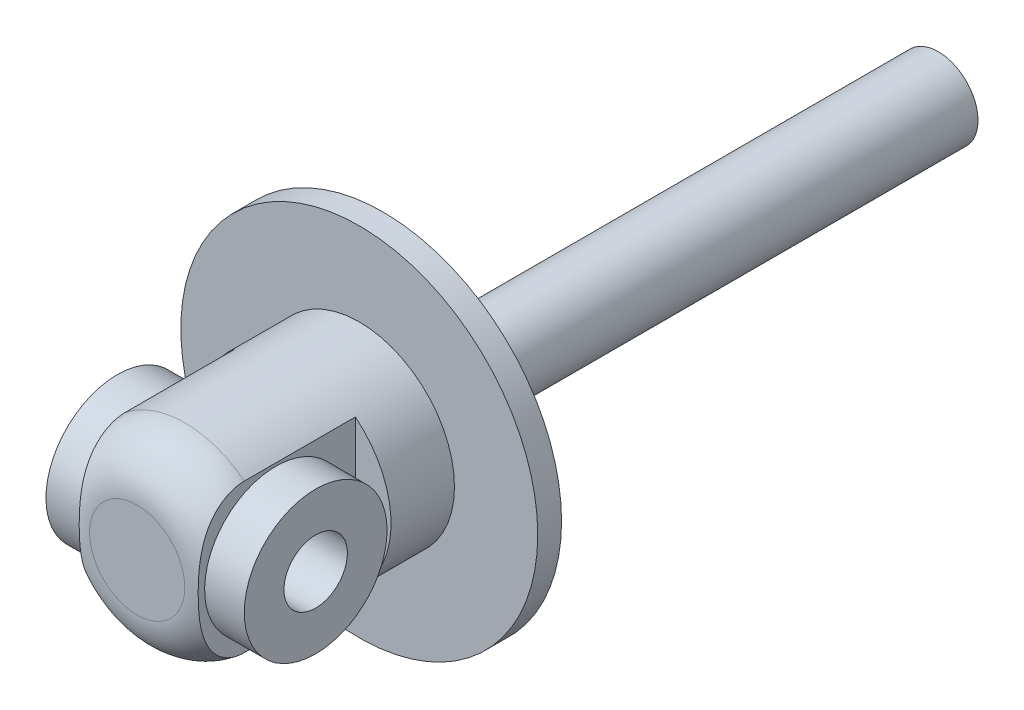
ISO-10303-21;
HEADER;
FILE_DESCRIPTION(('STEP AP214'),'2;1');
FILE_NAME('part.step','',(''),(''),'','','');
FILE_SCHEMA(('AUTOMOTIVE_DESIGN { 1 0 10303 214 1 1 1 1 }'));
ENDSEC;
DATA;
#1=APPLICATION_CONTEXT('core data for automotive mechanical design processes');
#2=APPLICATION_PROTOCOL_DEFINITION('international standard','automotive_design',2000,#1);
#3=PRODUCT_CONTEXT('',#1,'mechanical');
#4=PRODUCT('Part','Part','',(#3));
#5=PRODUCT_RELATED_PRODUCT_CATEGORY('part','',(#4));
#6=PRODUCT_DEFINITION_FORMATION('','',#4);
#7=PRODUCT_DEFINITION_CONTEXT('part definition',#1,'design');
#8=PRODUCT_DEFINITION('design','',#6,#7);
#9=PRODUCT_DEFINITION_SHAPE('','',#8);
#10=(LENGTH_UNIT() NAMED_UNIT(*) SI_UNIT(.MILLI.,.METRE.));
#11=(NAMED_UNIT(*) PLANE_ANGLE_UNIT() SI_UNIT($,.RADIAN.));
#12=(NAMED_UNIT(*) SI_UNIT($,.STERADIAN.) SOLID_ANGLE_UNIT());
#13=UNCERTAINTY_MEASURE_WITH_UNIT(LENGTH_MEASURE(1.E-05),#10,'distance_accuracy_value','');
#14=(GEOMETRIC_REPRESENTATION_CONTEXT(3) GLOBAL_UNCERTAINTY_ASSIGNED_CONTEXT((#13)) GLOBAL_UNIT_ASSIGNED_CONTEXT((#10,
#11,#12)) REPRESENTATION_CONTEXT('',''));
#15=CARTESIAN_POINT('',(0.,0.,0.));
#16=DIRECTION('',(0.,0.,1.));
#17=DIRECTION('',(1.,0.,0.));
#18=AXIS2_PLACEMENT_3D('',#15,#16,#17);
#19=CARTESIAN_POINT('',(0.,0.,101.));
#20=DIRECTION('',(0.,0.,-1.));
#21=DIRECTION('',(-1.,0.,0.));
#22=AXIS2_PLACEMENT_3D('',#19,#20,#21);
#23=CYLINDRICAL_SURFACE('',#22,12.);
#24=CARTESIAN_POINT('',(0.,0.,73.));
#25=DIRECTION('',(0.,0.,1.));
#26=DIRECTION('',(1.,0.,0.));
#27=AXIS2_PLACEMENT_3D('',#24,#25,#26);
#28=CIRCLE('',#27,12.);
#29=CARTESIAN_POINT('',(12.,0.,73.));
#30=VERTEX_POINT('',#29);
#31=EDGE_CURVE('E132',#30,#30,#28,.T.);
#32=ORIENTED_EDGE('',*,*,#31,.T.);
#33=EDGE_LOOP('',(#32));
#34=FACE_BOUND('',#33,.T.);
#35=DIRECTION('',(0.,0.,-1.));
#36=VECTOR('',#35,1.);
#37=CARTESIAN_POINT('',(-7.5,9.36749699759761,101.));
#38=LINE('',#37,#36);
#39=CARTESIAN_POINT('',(-7.5,9.3674969975976,95.));
#40=VERTEX_POINT('',#39);
#41=CARTESIAN_POINT('',(-7.5,9.36749699759761,81.));
#42=VERTEX_POINT('',#41);
#43=EDGE_CURVE('E80',#40,#42,#38,.T.);
#44=ORIENTED_EDGE('',*,*,#43,.F.);
#45=CARTESIAN_POINT('',(0.,0.,95.));
#46=DIRECTION('',(0.,0.,1.));
#47=DIRECTION('',(1.,0.,0.));
#48=AXIS2_PLACEMENT_3D('',#45,#46,#47);
#49=CIRCLE('',#48,12.);
#50=CARTESIAN_POINT('',(7.5,9.36749699759761,95.));
#51=VERTEX_POINT('',#50);
#52=EDGE_CURVE('E62',#40,#51,#49,.F.);
#53=ORIENTED_EDGE('',*,*,#52,.T.);
#54=DIRECTION('',(0.,0.,-1.));
#55=VECTOR('',#54,1.);
#56=CARTESIAN_POINT('',(7.5,9.36749699759761,101.));
#57=LINE('',#56,#55);
#58=CARTESIAN_POINT('',(7.5,9.36749699759761,81.));
#59=VERTEX_POINT('',#58);
#60=EDGE_CURVE('E143',#51,#59,#57,.T.);
#61=ORIENTED_EDGE('',*,*,#60,.T.);
#62=CARTESIAN_POINT('',(0.,0.,81.));
#63=DIRECTION('',(0.,0.,-1.));
#64=DIRECTION('',(-1.,0.,0.));
#65=AXIS2_PLACEMENT_3D('',#62,#63,#64);
#66=CIRCLE('',#65,12.);
#67=CARTESIAN_POINT('',(7.5,-9.3674969975976,81.));
#68=VERTEX_POINT('',#67);
#69=EDGE_CURVE('E96',#59,#68,#66,.T.);
#70=ORIENTED_EDGE('',*,*,#69,.T.);
#71=DIRECTION('',(0.,0.,-1.));
#72=VECTOR('',#71,1.);
#73=CARTESIAN_POINT('',(7.5,-9.3674969975976,101.));
#74=LINE('',#73,#72);
#75=CARTESIAN_POINT('',(7.5,-9.36749699759766,94.9999999999999));
#76=VERTEX_POINT('',#75);
#77=EDGE_CURVE('E149',#68,#76,#74,.F.);
#78=ORIENTED_EDGE('',*,*,#77,.T.);
#79=CARTESIAN_POINT('',(-7.5,-9.3674969975976,95.));
#80=VERTEX_POINT('',#79);
#81=EDGE_CURVE('E127',#76,#80,#49,.F.);
#82=ORIENTED_EDGE('',*,*,#81,.T.);
#83=DIRECTION('',(0.,0.,-1.));
#84=VECTOR('',#83,1.);
#85=CARTESIAN_POINT('',(-7.5,-9.3674969975976,101.));
#86=LINE('',#85,#84);
#87=CARTESIAN_POINT('',(-7.5,-9.3674969975976,81.));
#88=VERTEX_POINT('',#87);
#89=EDGE_CURVE('E54',#88,#80,#86,.F.);
#90=ORIENTED_EDGE('',*,*,#89,.F.);
#91=CARTESIAN_POINT('',(0.,0.,81.));
#92=DIRECTION('',(0.,0.,-1.));
#93=DIRECTION('',(-1.,0.,0.));
#94=AXIS2_PLACEMENT_3D('',#91,#92,#93);
#95=CIRCLE('',#94,12.);
#96=EDGE_CURVE('E90',#88,#42,#95,.T.);
#97=ORIENTED_EDGE('',*,*,#96,.T.);
#98=EDGE_LOOP('',(#44,#53,#61,#70,#78,#82,#90,#97));
#99=FACE_BOUND('',#98,.T.);
#100=ADVANCED_FACE('F38',(#34,#99),#23,.T.);
#101=CARTESIAN_POINT('',(0.,0.,95.));
#102=DIRECTION('',(0.,0.,1.));
#103=DIRECTION('',(1.,0.,0.));
#104=AXIS2_PLACEMENT_3D('',#101,#102,#103);
#105=TOROIDAL_SURFACE('',#104,6.,6.);
#106=CARTESIAN_POINT('',(0.,0.,101.));
#107=DIRECTION('',(0.,0.,1.));
#108=DIRECTION('',(1.,0.,0.));
#109=AXIS2_PLACEMENT_3D('',#106,#107,#108);
#110=CIRCLE('',#109,6.);
#111=CARTESIAN_POINT('',(6.,0.,101.));
#112=VERTEX_POINT('',#111);
#113=EDGE_CURVE('E129',#112,#112,#110,.T.);
#114=ORIENTED_EDGE('',*,*,#113,.F.);
#115=EDGE_LOOP('',(#114));
#116=FACE_BOUND('',#115,.T.);
#117=ORIENTED_EDGE('',*,*,#52,.F.);
#118=CARTESIAN_POINT('',(-7.5,0.,100.809475019311));
#119=CARTESIAN_POINT('',(-7.5,-0.18452162824242,100.809475295815));
#120=CARTESIAN_POINT('',(-7.5,-0.369043480287192,100.8077270323));
#121=CARTESIAN_POINT('',(-7.5,-0.737999394292285,100.800613062888));
#122=CARTESIAN_POINT('',(-7.5,-0.922433463434385,100.795247736707));
#123=CARTESIAN_POINT('',(-7.5,-1.29122559425462,100.780538513706));
#124=CARTESIAN_POINT('',(-7.5,-1.47558358999919,100.771192921557));
#125=CARTESIAN_POINT('',(-7.5,-1.84401846668315,100.747950764088));
#126=CARTESIAN_POINT('',(-7.5,-2.02809534398339,100.734054140347));
#127=CARTESIAN_POINT('',(-7.5,-2.39498843631837,100.701027325669));
#128=CARTESIAN_POINT('',(-7.5,-2.57780665418326,100.681920129909));
#129=CARTESIAN_POINT('',(-7.5,-2.94269408038084,100.637568221756));
#130=CARTESIAN_POINT('',(-7.5,-3.12476323156505,100.612323049597));
#131=CARTESIAN_POINT('',(-7.5,-3.6691632505479,100.525936026226));
#132=CARTESIAN_POINT('',(-7.5,-4.02997739530099,100.454119622395));
#133=CARTESIAN_POINT('',(-7.5,-4.57935988961709,100.315114172541));
#134=CARTESIAN_POINT('',(-7.5,-4.77122256452969,100.26083488487));
#135=CARTESIAN_POINT('',(-7.5,-5.15109529504943,100.140241103609));
#136=CARTESIAN_POINT('',(-7.5,-5.33910680786539,100.073931259408));
#137=CARTESIAN_POINT('',(-7.5,-5.70992505463463,99.9281486989919));
#138=CARTESIAN_POINT('',(-7.5,-5.8927332791208,99.8486797977089));
#139=CARTESIAN_POINT('',(-7.5,-6.25155879665883,99.6756224712841));
#140=CARTESIAN_POINT('',(-7.5,-6.42757723883459,99.5820364486502));
#141=CARTESIAN_POINT('',(-7.5,-6.74413785402997,99.3958384208508));
#142=CARTESIAN_POINT('',(-7.5,-6.88593021366759,99.3053527427416));
#143=CARTESIAN_POINT('',(-7.5,-7.16205254122038,99.1136422044668));
#144=CARTESIAN_POINT('',(-7.5,-7.29638393401336,99.0124194056704));
#145=CARTESIAN_POINT('',(-7.5,-7.55627452274061,98.7991822855038));
#146=CARTESIAN_POINT('',(-7.5,-7.68183150549919,98.6871652583255));
#147=CARTESIAN_POINT('',(-7.5,-7.92270374400351,98.4525813942248));
#148=CARTESIAN_POINT('',(-7.5,-8.03801892249802,98.3300144777409));
#149=CARTESIAN_POINT('',(-7.5,-8.25792234562975,98.0736714823962));
#150=CARTESIAN_POINT('',(-7.5,-8.36240569865935,97.9398051473305));
#151=CARTESIAN_POINT('',(-7.5,-8.55796576900282,97.662616920615));
#152=CARTESIAN_POINT('',(-7.5,-8.64904436046083,97.5192963548439));
#153=CARTESIAN_POINT('',(-7.5,-8.81636481076626,97.2243409104845));
#154=CARTESIAN_POINT('',(-7.5,-8.89261579636784,97.0727112205184));
#155=CARTESIAN_POINT('',(-7.5,-9.02909243430965,96.7624095052739));
#156=CARTESIAN_POINT('',(-7.5,-9.08932115899453,96.6037388369551));
#157=CARTESIAN_POINT('',(-7.5,-9.1849514334904,96.3052245459151));
#158=CARTESIAN_POINT('',(-7.5,-9.22272405795734,96.166136129491));
#159=CARTESIAN_POINT('',(-7.5,-9.28547940350164,95.8851087613884));
#160=CARTESIAN_POINT('',(-7.5,-9.31046370365637,95.7431701638949));
#161=CARTESIAN_POINT('',(-7.5,-9.34730641699016,95.4576599589478));
#162=CARTESIAN_POINT('',(-7.5,-9.35917031033292,95.3140890586128));
#163=CARTESIAN_POINT('',(-7.5,-9.36963164548865,95.0264648581988));
#164=CARTESIAN_POINT('',(-7.5,-9.36822954903947,94.8824115750842));
#165=CARTESIAN_POINT('',(-7.5,-9.35280339576898,94.6061914815275));
#166=CARTESIAN_POINT('',(-7.5,-9.33976569953801,94.4739684759153));
#167=CARTESIAN_POINT('',(-7.5,-9.3025636387872,94.2110534946456));
#168=CARTESIAN_POINT('',(-7.5,-9.27839574533066,94.0803620180608));
#169=CARTESIAN_POINT('',(-7.5,-9.21922065645586,93.8215410609612));
#170=CARTESIAN_POINT('',(-7.5,-9.18421981495561,93.6934101253726));
#171=CARTESIAN_POINT('',(-7.5,-9.1037455253616,93.4404340442512));
#172=CARTESIAN_POINT('',(-7.5,-9.05826815366643,93.3155901493276));
#173=CARTESIAN_POINT('',(-7.5,-8.95699564520569,93.0692031015505));
#174=CARTESIAN_POINT('',(-7.5,-8.90113499399755,92.9476868658852));
#175=CARTESIAN_POINT('',(-7.5,-8.77987692751896,92.7094920695402));
#176=CARTESIAN_POINT('',(-7.5,-8.71447610526943,92.5928152563103));
#177=CARTESIAN_POINT('',(-7.5,-8.50489875856371,92.2509911073174));
#178=CARTESIAN_POINT('',(-7.5,-8.34729299116934,92.0339195251877));
#179=CARTESIAN_POINT('',(-7.5,-7.98870608163152,91.609337427954));
#180=CARTESIAN_POINT('',(-7.5,-7.78529755950601,91.4039002281567));
#181=CARTESIAN_POINT('',(-7.5,-7.35109040646743,91.0246758733926));
#182=CARTESIAN_POINT('',(-7.5,-7.12029612399674,90.8508837047537));
#183=CARTESIAN_POINT('',(-7.5,-6.69864287979115,90.5744409595824));
#184=CARTESIAN_POINT('',(-7.5,-6.51223410047273,90.4648689537028));
#185=CARTESIAN_POINT('',(-7.5,-6.13034538679086,90.2626904112623));
#186=CARTESIAN_POINT('',(-7.5,-5.93486117014359,90.1700919878543));
#187=CARTESIAN_POINT('',(-7.5,-5.53658641063458,90.0006313082269));
#188=CARTESIAN_POINT('',(-7.5,-5.33377659321381,89.9238147555949));
#189=CARTESIAN_POINT('',(-7.5,-4.92331428460811,89.784875362625));
#190=CARTESIAN_POINT('',(-7.5,-4.71566315546475,89.7227484430634));
#191=CARTESIAN_POINT('',(-7.5,-4.02250667384637,89.5386673542946));
#192=CARTESIAN_POINT('',(-7.5,-3.52942656369883,89.4449803111871));
#193=CARTESIAN_POINT('',(-7.5,-2.78498720051468,89.3412352530644));
#194=CARTESIAN_POINT('',(-7.5,-2.53568557770051,89.3127705467372));
#195=CARTESIAN_POINT('',(-7.5,-2.0361243493744,89.2658269581612));
#196=CARTESIAN_POINT('',(-7.5,-1.78586486368144,89.2473468655649));
#197=CARTESIAN_POINT('',(-7.5,-1.28363112408655,89.2184283009414));
#198=CARTESIAN_POINT('',(-7.5,-1.03165466176094,89.208031590786));
#199=CARTESIAN_POINT('',(-7.5,-0.527501194688705,89.1941849220444));
#200=CARTESIAN_POINT('',(-7.5,-0.275324180848937,89.1907352988047));
#201=CARTESIAN_POINT('',(-7.5,0.228731345602949,89.1903333462322));
#202=CARTESIAN_POINT('',(-7.5,0.480609853630147,89.193373232494));
#203=CARTESIAN_POINT('',(-7.5,0.984173581494238,89.2063332691715));
#204=CARTESIAN_POINT('',(-7.5,1.23585881660871,89.2162528039697));
#205=CARTESIAN_POINT('',(-7.5,1.76278825668931,89.2454935008678));
#206=CARTESIAN_POINT('',(-7.5,2.03798990109169,89.2656211327378));
#207=CARTESIAN_POINT('',(-7.5,2.58731345976837,89.3180418431017));
#208=CARTESIAN_POINT('',(-7.5,2.86143522597442,89.3503365349836));
#209=CARTESIAN_POINT('',(-7.5,3.40623279358435,89.4300545548583));
#210=CARTESIAN_POINT('',(-7.5,3.67691867401872,89.4774071358833));
#211=CARTESIAN_POINT('',(-7.5,4.2143947607995,89.5907053400646));
#212=CARTESIAN_POINT('',(-7.5,4.48118620316469,89.6566449229111));
#213=CARTESIAN_POINT('',(-7.5,4.94217748017442,89.7911834026755));
#214=CARTESIAN_POINT('',(-7.5,5.13778160857806,89.8549558474619));
#215=CARTESIAN_POINT('',(-7.5,5.52399422741739,89.9961265709521));
#216=CARTESIAN_POINT('',(-7.5,5.71460418712136,90.073520789267));
#217=CARTESIAN_POINT('',(-7.5,6.08921987221889,90.2430793617625));
#218=CARTESIAN_POINT('',(-7.5,6.27322442084438,90.3352463319138));
#219=CARTESIAN_POINT('',(-7.5,6.63256976145457,90.5351759469553));
#220=CARTESIAN_POINT('',(-7.5,6.80791280693597,90.6429345063483));
#221=CARTESIAN_POINT('',(-7.5,7.10989658300674,90.8487615005737));
#222=CARTESIAN_POINT('',(-7.5,7.2387010399764,90.9436617626469));
#223=CARTESIAN_POINT('',(-7.5,7.4885662206622,91.143229826346));
#224=CARTESIAN_POINT('',(-7.5,7.60962602152205,91.2478987883735));
#225=CARTESIAN_POINT('',(-7.5,7.84271387792474,91.4668045949393));
#226=CARTESIAN_POINT('',(-7.5,7.95474473789612,91.5810384459287));
#227=CARTESIAN_POINT('',(-7.5,8.16854933672494,91.8187268203134));
#228=CARTESIAN_POINT('',(-7.5,8.27032449994957,91.9421800591116));
#229=CARTESIAN_POINT('',(-7.5,8.46313596223061,92.1987356397018));
#230=CARTESIAN_POINT('',(-7.5,8.55408255407203,92.3319055781875));
#231=CARTESIAN_POINT('',(-7.5,8.72304401015934,92.6061418402458));
#232=CARTESIAN_POINT('',(-7.5,8.80106500403696,92.747204378254));
#233=CARTESIAN_POINT('',(-7.5,8.94309470867639,93.0362068877473));
#234=CARTESIAN_POINT('',(-7.5,9.00710515749598,93.1841460034049));
#235=CARTESIAN_POINT('',(-7.5,9.12014361193693,93.4856380297523));
#236=CARTESIAN_POINT('',(-7.5,9.16917373274798,93.6391901444676));
#237=CARTESIAN_POINT('',(-7.5,9.24643392787081,93.9313639562727));
#238=CARTESIAN_POINT('',(-7.5,9.27647685632879,94.0695088202567));
#239=CARTESIAN_POINT('',(-7.5,9.32406143536891,94.3479315795213));
#240=CARTESIAN_POINT('',(-7.5,9.34160421520928,94.4882092809526));
#241=CARTESIAN_POINT('',(-7.5,9.36396002322679,94.769719609589));
#242=CARTESIAN_POINT('',(-7.5,9.36877802253041,94.9109518422674));
#243=CARTESIAN_POINT('',(-7.5,9.36563613906261,95.1932734390957));
#244=CARTESIAN_POINT('',(-7.5,9.35767657732182,95.3343628067459));
#245=CARTESIAN_POINT('',(-7.5,9.32998563551063,95.6064011749062));
#246=CARTESIAN_POINT('',(-7.5,9.31102660205279,95.7374295539783));
#247=CARTESIAN_POINT('',(-7.5,9.26218788836622,95.9974780227225));
#248=CARTESIAN_POINT('',(-7.5,9.23230470755187,96.1264974548056));
#249=CARTESIAN_POINT('',(-7.5,9.16196479385525,96.3815508516768));
#250=CARTESIAN_POINT('',(-7.5,9.12151307666089,96.5075862018084));
#251=CARTESIAN_POINT('',(-7.5,9.03044888037394,96.7559772755244));
#252=CARTESIAN_POINT('',(-7.5,8.97983258590814,96.8783315975104));
#253=CARTESIAN_POINT('',(-7.5,8.8680617574251,97.1205569584555));
#254=CARTESIAN_POINT('',(-7.5,8.80674877020291,97.2403549182387));
#255=CARTESIAN_POINT('',(-7.5,8.67480187441993,97.4747211723638));
#256=CARTESIAN_POINT('',(-7.5,8.60416462323317,97.5892875713423));
#257=CARTESIAN_POINT('',(-7.5,8.37928997825774,97.9242270275788));
#258=CARTESIAN_POINT('',(-7.5,8.21201407264853,98.13600210755));
#259=CARTESIAN_POINT('',(-7.5,7.83294273917802,98.5504485361803));
#260=CARTESIAN_POINT('',(-7.5,7.61853228584702,98.7507010772538));
#261=CARTESIAN_POINT('',(-7.5,7.163378828173,99.1185076671662));
#262=CARTESIAN_POINT('',(-7.5,6.92262753032981,99.2860513710233));
#263=CARTESIAN_POINT('',(-7.5,6.47886643959531,99.5545024709803));
#264=CARTESIAN_POINT('',(-7.5,6.279707295078,99.6619013252763));
#265=CARTESIAN_POINT('',(-7.5,5.87254463104013,99.858559219587));
#266=CARTESIAN_POINT('',(-7.5,5.66453691936402,99.9478095430477));
#267=CARTESIAN_POINT('',(-7.5,5.24180758530234,100.10962149737));
#268=CARTESIAN_POINT('',(-7.5,5.02707553901333,100.182155596005));
#269=CARTESIAN_POINT('',(-7.5,4.59305326757358,100.312100136976));
#270=CARTESIAN_POINT('',(-7.5,4.37376133898658,100.369504813784));
#271=CARTESIAN_POINT('',(-7.5,3.81417726059939,100.498188674937));
#272=CARTESIAN_POINT('',(-7.5,3.47183296905171,100.560495171619));
#273=CARTESIAN_POINT('',(-7.5,2.78359200614871,100.660901968433));
#274=CARTESIAN_POINT('',(-7.5,2.43769315620306,100.698986397292));
#275=CARTESIAN_POINT('',(-7.5,1.91723181279189,100.742556330873));
#276=CARTESIAN_POINT('',(-7.5,1.74318957751327,100.754829112802));
#277=CARTESIAN_POINT('',(-7.5,1.39487161182968,100.775398699579));
#278=CARTESIAN_POINT('',(-7.5,1.22059588725639,100.78369560194));
#279=CARTESIAN_POINT('',(-7.5,0.871965392986048,100.796777523185));
#280=CARTESIAN_POINT('',(-7.5,0.697610658492178,100.801563512939));
#281=CARTESIAN_POINT('',(-7.5,0.348837350643898,100.807912185599));
#282=CARTESIAN_POINT('',(-7.5,0.17441877530504,100.809474757946));
#283=CARTESIAN_POINT('',(-7.5,0.,100.809475019311));
#284=B_SPLINE_CURVE_WITH_KNOTS('',3,(#118,#119,#120,#121,#122,#123,#124,#125,#126,#127,#128,
#129,#130,#131,#132,#133,#134,#135,#136,#137,#138,#139,#140,#141,#142,#143,#144,#145,#146,#147,
#148,#149,#150,#151,#152,#153,#154,#155,#156,#157,#158,#159,#160,#161,#162,#163,#164,#165,#166,
#167,#168,#169,#170,#171,#172,#173,#174,#175,#176,#177,#178,#179,#180,#181,#182,#183,#184,#185,
#186,#187,#188,#189,#190,#191,#192,#193,#194,#195,#196,#197,#198,#199,#200,#201,#202,#203,#204,
#205,#206,#207,#208,#209,#210,#211,#212,#213,#214,#215,#216,#217,#218,#219,#220,#221,#222,#223,
#224,#225,#226,#227,#228,#229,#230,#231,#232,#233,#234,#235,#236,#237,#238,#239,#240,#241,#242,
#243,#244,#245,#246,#247,#248,#249,#250,#251,#252,#253,#254,#255,#256,#257,#258,#259,#260,#261,
#262,#263,#264,#265,#266,#267,#268,#269,#270,#271,#272,#273,#274,#275,#276,#277,#278,#279,#280,
#281,#282,#283),.UNSPECIFIED.,.T.,.F.,(4,2,2,2,2,2,2,2,2,2,2,2,2,2,2,2,2,2,2,2,2,2,2,2,2,2,2,2,
2,2,2,2,2,2,2,2,2,2,2,2,2,2,2,2,2,2,2,2,2,2,2,2,2,2,2,2,2,2,2,2,2,2,2,2,2,2,2,2,2,2,2,2,2,2,2,2,
2,2,2,2,2,2,4),(0.,0.553556541747908,1.10705498067111,1.66078940935171,2.21453094651203,
2.7658672034967,3.31724477121585,4.41912680182767,5.01698525599297,5.61461314908642,
6.21206808675634,6.80942146164092,7.31357153503216,7.81762499361291,8.32180513447661,
8.82598907791493,9.33467160980087,9.84328295415676,10.3515802378956,10.8597799828438,
11.291588037567,11.7233427606027,12.1549170790764,12.5864763761706,12.9845986570771,
13.3828472534997,13.7808627038906,14.1790274594522,14.5797954507881,14.9807069160888,
15.7821103743006,16.6461503316802,17.5100532757815,18.1578732554314,18.8060020817716,
19.4559821948788,20.1057815998326,21.6069748462105,22.3596793389022,23.1122925673175,
23.8687687149109,24.6252813779039,25.3808870860738,26.1364251884592,26.9640249034878,
27.7917343993232,28.6156111127982,29.4392203950451,30.0559954213971,30.6725869093732,
31.2892877047367,31.9058271963482,32.3853559200308,32.86494167852,33.3443778968313,
33.823747436381,34.3068464150844,34.7897156366603,35.2725249226045,35.7552660053908,
36.1788379642465,36.6023716529342,37.0257398573389,37.4490974249689,37.8458122806135,
38.2426543730445,38.639308470493,39.0361117351622,39.4393886143668,39.8428104576492,
40.6491243408276,41.5260051520067,42.4031628508039,43.0810551134699,43.7592721958252,
44.4385984678267,45.1181832448308,46.1608437011148,47.2041866484774,47.7275747628343,
48.2509500399341,48.7741805338585,49.2974289735857),.UNSPECIFIED.);
#285=EDGE_CURVE('E84',#40,#80,#284,.T.);
#286=ORIENTED_EDGE('',*,*,#285,.T.);
#287=ORIENTED_EDGE('',*,*,#81,.F.);
#288=CARTESIAN_POINT('',(7.5,0.,100.809475019311));
#289=CARTESIAN_POINT('',(7.5,-0.18452162824242,100.809475295815));
#290=CARTESIAN_POINT('',(7.5,-0.369043480287192,100.8077270323));
#291=CARTESIAN_POINT('',(7.5,-0.737999394292285,100.800613062888));
#292=CARTESIAN_POINT('',(7.5,-0.922433463434385,100.795247736707));
#293=CARTESIAN_POINT('',(7.5,-1.29122559425462,100.780538513706));
#294=CARTESIAN_POINT('',(7.5,-1.47558358999919,100.771192921557));
#295=CARTESIAN_POINT('',(7.5,-1.84401846668315,100.747950764088));
#296=CARTESIAN_POINT('',(7.5,-2.02809534398339,100.734054140347));
#297=CARTESIAN_POINT('',(7.5,-2.39498843631837,100.701027325669));
#298=CARTESIAN_POINT('',(7.5,-2.57780665418326,100.681920129909));
#299=CARTESIAN_POINT('',(7.5,-2.94269408038084,100.637568221756));
#300=CARTESIAN_POINT('',(7.5,-3.12476323156505,100.612323049597));
#301=CARTESIAN_POINT('',(7.5,-3.6691632505479,100.525936026226));
#302=CARTESIAN_POINT('',(7.5,-4.02997739530099,100.454119622395));
#303=CARTESIAN_POINT('',(7.5,-4.57935988961709,100.315114172541));
#304=CARTESIAN_POINT('',(7.5,-4.77122256452969,100.26083488487));
#305=CARTESIAN_POINT('',(7.5,-5.15109529504943,100.140241103609));
#306=CARTESIAN_POINT('',(7.5,-5.33910680786539,100.073931259408));
#307=CARTESIAN_POINT('',(7.5,-5.70992505463463,99.9281486989919));
#308=CARTESIAN_POINT('',(7.5,-5.8927332791208,99.8486797977089));
#309=CARTESIAN_POINT('',(7.5,-6.25155879665883,99.6756224712841));
#310=CARTESIAN_POINT('',(7.5,-6.42757723883459,99.5820364486502));
#311=CARTESIAN_POINT('',(7.5,-6.74413785402997,99.3958384208508));
#312=CARTESIAN_POINT('',(7.5,-6.88593021366759,99.3053527427416));
#313=CARTESIAN_POINT('',(7.5,-7.16205254122038,99.1136422044668));
#314=CARTESIAN_POINT('',(7.5,-7.29638393401336,99.0124194056704));
#315=CARTESIAN_POINT('',(7.5,-7.55627452274061,98.7991822855038));
#316=CARTESIAN_POINT('',(7.5,-7.68183150549919,98.6871652583255));
#317=CARTESIAN_POINT('',(7.5,-7.92270374400351,98.4525813942248));
#318=CARTESIAN_POINT('',(7.5,-8.03801892249802,98.3300144777409));
#319=CARTESIAN_POINT('',(7.5,-8.25792234562975,98.0736714823962));
#320=CARTESIAN_POINT('',(7.5,-8.36240569865935,97.9398051473305));
#321=CARTESIAN_POINT('',(7.5,-8.55796576900282,97.662616920615));
#322=CARTESIAN_POINT('',(7.5,-8.64904436046083,97.5192963548439));
#323=CARTESIAN_POINT('',(7.5,-8.81636481076626,97.2243409104845));
#324=CARTESIAN_POINT('',(7.5,-8.89261579636784,97.0727112205184));
#325=CARTESIAN_POINT('',(7.5,-9.02909243430965,96.7624095052739));
#326=CARTESIAN_POINT('',(7.5,-9.08932115899453,96.6037388369551));
#327=CARTESIAN_POINT('',(7.5,-9.1849514334904,96.3052245459151));
#328=CARTESIAN_POINT('',(7.5,-9.22272405795734,96.166136129491));
#329=CARTESIAN_POINT('',(7.5,-9.28547940350164,95.8851087613884));
#330=CARTESIAN_POINT('',(7.5,-9.31046370365637,95.7431701638949));
#331=CARTESIAN_POINT('',(7.5,-9.34730641699016,95.4576599589478));
#332=CARTESIAN_POINT('',(7.5,-9.35917031033292,95.3140890586128));
#333=CARTESIAN_POINT('',(7.5,-9.36963164548865,95.0264648581988));
#334=CARTESIAN_POINT('',(7.5,-9.36822954903947,94.8824115750842));
#335=CARTESIAN_POINT('',(7.5,-9.35280339576898,94.6061914815275));
#336=CARTESIAN_POINT('',(7.5,-9.33976569953801,94.4739684759153));
#337=CARTESIAN_POINT('',(7.5,-9.3025636387872,94.2110534946456));
#338=CARTESIAN_POINT('',(7.5,-9.27839574533066,94.0803620180608));
#339=CARTESIAN_POINT('',(7.5,-9.21922065645586,93.8215410609612));
#340=CARTESIAN_POINT('',(7.5,-9.18421981495561,93.6934101253726));
#341=CARTESIAN_POINT('',(7.5,-9.1037455253616,93.4404340442512));
#342=CARTESIAN_POINT('',(7.5,-9.05826815366643,93.3155901493276));
#343=CARTESIAN_POINT('',(7.5,-8.95699564520569,93.0692031015505));
#344=CARTESIAN_POINT('',(7.5,-8.90113499399755,92.9476868658852));
#345=CARTESIAN_POINT('',(7.5,-8.77987692751896,92.7094920695402));
#346=CARTESIAN_POINT('',(7.5,-8.71447610526943,92.5928152563103));
#347=CARTESIAN_POINT('',(7.5,-8.50489875856371,92.2509911073174));
#348=CARTESIAN_POINT('',(7.5,-8.34729299116934,92.0339195251877));
#349=CARTESIAN_POINT('',(7.5,-7.98870608163152,91.609337427954));
#350=CARTESIAN_POINT('',(7.5,-7.78529755950601,91.4039002281567));
#351=CARTESIAN_POINT('',(7.5,-7.35109040646743,91.0246758733926));
#352=CARTESIAN_POINT('',(7.5,-7.12029612399674,90.8508837047537));
#353=CARTESIAN_POINT('',(7.5,-6.69864287979115,90.5744409595824));
#354=CARTESIAN_POINT('',(7.5,-6.51223410047273,90.4648689537028));
#355=CARTESIAN_POINT('',(7.5,-6.13034538679086,90.2626904112623));
#356=CARTESIAN_POINT('',(7.5,-5.93486117014359,90.1700919878543));
#357=CARTESIAN_POINT('',(7.5,-5.53658641063458,90.0006313082269));
#358=CARTESIAN_POINT('',(7.5,-5.33377659321381,89.9238147555949));
#359=CARTESIAN_POINT('',(7.5,-4.92331428460811,89.784875362625));
#360=CARTESIAN_POINT('',(7.5,-4.71566315546475,89.7227484430634));
#361=CARTESIAN_POINT('',(7.5,-4.02250667384637,89.5386673542946));
#362=CARTESIAN_POINT('',(7.5,-3.52942656369883,89.4449803111871));
#363=CARTESIAN_POINT('',(7.5,-2.78498720051468,89.3412352530644));
#364=CARTESIAN_POINT('',(7.5,-2.53568557770051,89.3127705467372));
#365=CARTESIAN_POINT('',(7.5,-2.0361243493744,89.2658269581612));
#366=CARTESIAN_POINT('',(7.5,-1.78586486368144,89.2473468655649));
#367=CARTESIAN_POINT('',(7.5,-1.28363112408655,89.2184283009414));
#368=CARTESIAN_POINT('',(7.5,-1.03165466176094,89.208031590786));
#369=CARTESIAN_POINT('',(7.5,-0.527501194688705,89.1941849220444));
#370=CARTESIAN_POINT('',(7.5,-0.275324180848937,89.1907352988047));
#371=CARTESIAN_POINT('',(7.5,0.228731345602949,89.1903333462322));
#372=CARTESIAN_POINT('',(7.5,0.480609853630147,89.193373232494));
#373=CARTESIAN_POINT('',(7.5,0.984173581494238,89.2063332691715));
#374=CARTESIAN_POINT('',(7.5,1.23585881660871,89.2162528039697));
#375=CARTESIAN_POINT('',(7.5,1.76278825668931,89.2454935008678));
#376=CARTESIAN_POINT('',(7.5,2.03798990109169,89.2656211327378));
#377=CARTESIAN_POINT('',(7.5,2.58731345976837,89.3180418431017));
#378=CARTESIAN_POINT('',(7.5,2.86143522597442,89.3503365349836));
#379=CARTESIAN_POINT('',(7.5,3.40623279358435,89.4300545548583));
#380=CARTESIAN_POINT('',(7.5,3.67691867401872,89.4774071358833));
#381=CARTESIAN_POINT('',(7.5,4.2143947607995,89.5907053400646));
#382=CARTESIAN_POINT('',(7.5,4.48118620316469,89.6566449229111));
#383=CARTESIAN_POINT('',(7.5,4.94217748017442,89.7911834026755));
#384=CARTESIAN_POINT('',(7.5,5.13778160857806,89.8549558474619));
#385=CARTESIAN_POINT('',(7.5,5.52399422741739,89.9961265709521));
#386=CARTESIAN_POINT('',(7.5,5.71460418712136,90.073520789267));
#387=CARTESIAN_POINT('',(7.5,6.08921987221889,90.2430793617625));
#388=CARTESIAN_POINT('',(7.5,6.27322442084438,90.3352463319138));
#389=CARTESIAN_POINT('',(7.5,6.63256976145457,90.5351759469553));
#390=CARTESIAN_POINT('',(7.5,6.80791280693597,90.6429345063483));
#391=CARTESIAN_POINT('',(7.5,7.10989658300674,90.8487615005737));
#392=CARTESIAN_POINT('',(7.5,7.2387010399764,90.9436617626469));
#393=CARTESIAN_POINT('',(7.5,7.4885662206622,91.143229826346));
#394=CARTESIAN_POINT('',(7.5,7.60962602152205,91.2478987883735));
#395=CARTESIAN_POINT('',(7.5,7.84271387792474,91.4668045949393));
#396=CARTESIAN_POINT('',(7.5,7.95474473789612,91.5810384459287));
#397=CARTESIAN_POINT('',(7.5,8.16854933672494,91.8187268203134));
#398=CARTESIAN_POINT('',(7.5,8.27032449994957,91.9421800591116));
#399=CARTESIAN_POINT('',(7.5,8.46313596223061,92.1987356397018));
#400=CARTESIAN_POINT('',(7.5,8.55408255407203,92.3319055781875));
#401=CARTESIAN_POINT('',(7.5,8.72304401015934,92.6061418402458));
#402=CARTESIAN_POINT('',(7.5,8.80106500403696,92.747204378254));
#403=CARTESIAN_POINT('',(7.5,8.94309470867639,93.0362068877473));
#404=CARTESIAN_POINT('',(7.5,9.00710515749598,93.1841460034049));
#405=CARTESIAN_POINT('',(7.5,9.12014361193693,93.4856380297523));
#406=CARTESIAN_POINT('',(7.5,9.16917373274798,93.6391901444676));
#407=CARTESIAN_POINT('',(7.5,9.24643392787081,93.9313639562727));
#408=CARTESIAN_POINT('',(7.5,9.27647685632879,94.0695088202567));
#409=CARTESIAN_POINT('',(7.5,9.32406143536891,94.3479315795213));
#410=CARTESIAN_POINT('',(7.5,9.34160421520928,94.4882092809526));
#411=CARTESIAN_POINT('',(7.5,9.36396002322679,94.769719609589));
#412=CARTESIAN_POINT('',(7.5,9.36877802253041,94.9109518422674));
#413=CARTESIAN_POINT('',(7.5,9.36563613906261,95.1932734390957));
#414=CARTESIAN_POINT('',(7.5,9.35767657732182,95.3343628067459));
#415=CARTESIAN_POINT('',(7.5,9.32998563551063,95.6064011749062));
#416=CARTESIAN_POINT('',(7.5,9.31102660205279,95.7374295539783));
#417=CARTESIAN_POINT('',(7.5,9.26218788836622,95.9974780227225));
#418=CARTESIAN_POINT('',(7.5,9.23230470755187,96.1264974548056));
#419=CARTESIAN_POINT('',(7.5,9.16196479385525,96.3815508516768));
#420=CARTESIAN_POINT('',(7.5,9.12151307666089,96.5075862018084));
#421=CARTESIAN_POINT('',(7.5,9.03044888037394,96.7559772755244));
#422=CARTESIAN_POINT('',(7.5,8.97983258590814,96.8783315975104));
#423=CARTESIAN_POINT('',(7.5,8.8680617574251,97.1205569584555));
#424=CARTESIAN_POINT('',(7.5,8.80674877020291,97.2403549182387));
#425=CARTESIAN_POINT('',(7.5,8.67480187441993,97.4747211723638));
#426=CARTESIAN_POINT('',(7.5,8.60416462323317,97.5892875713423));
#427=CARTESIAN_POINT('',(7.5,8.37928997825774,97.9242270275788));
#428=CARTESIAN_POINT('',(7.5,8.21201407264853,98.13600210755));
#429=CARTESIAN_POINT('',(7.5,7.83294273917802,98.5504485361803));
#430=CARTESIAN_POINT('',(7.5,7.61853228584702,98.7507010772538));
#431=CARTESIAN_POINT('',(7.5,7.163378828173,99.1185076671662));
#432=CARTESIAN_POINT('',(7.5,6.92262753032981,99.2860513710233));
#433=CARTESIAN_POINT('',(7.5,6.47886643959531,99.5545024709803));
#434=CARTESIAN_POINT('',(7.5,6.279707295078,99.6619013252763));
#435=CARTESIAN_POINT('',(7.5,5.87254463104013,99.858559219587));
#436=CARTESIAN_POINT('',(7.5,5.66453691936402,99.9478095430477));
#437=CARTESIAN_POINT('',(7.5,5.24180758530234,100.10962149737));
#438=CARTESIAN_POINT('',(7.5,5.02707553901333,100.182155596005));
#439=CARTESIAN_POINT('',(7.5,4.59305326757358,100.312100136976));
#440=CARTESIAN_POINT('',(7.5,4.37376133898658,100.369504813784));
#441=CARTESIAN_POINT('',(7.5,3.81417726059939,100.498188674937));
#442=CARTESIAN_POINT('',(7.5,3.47183296905171,100.560495171619));
#443=CARTESIAN_POINT('',(7.5,2.78359200614871,100.660901968433));
#444=CARTESIAN_POINT('',(7.5,2.43769315620306,100.698986397292));
#445=CARTESIAN_POINT('',(7.5,1.91723181279189,100.742556330873));
#446=CARTESIAN_POINT('',(7.5,1.74318957751327,100.754829112802));
#447=CARTESIAN_POINT('',(7.5,1.39487161182968,100.775398699579));
#448=CARTESIAN_POINT('',(7.5,1.22059588725639,100.78369560194));
#449=CARTESIAN_POINT('',(7.5,0.871965392986048,100.796777523185));
#450=CARTESIAN_POINT('',(7.5,0.697610658492178,100.801563512939));
#451=CARTESIAN_POINT('',(7.5,0.348837350643898,100.807912185599));
#452=CARTESIAN_POINT('',(7.5,0.17441877530504,100.809474757946));
#453=CARTESIAN_POINT('',(7.5,0.,100.809475019311));
#454=B_SPLINE_CURVE_WITH_KNOTS('',3,(#288,#289,#290,#291,#292,#293,#294,#295,#296,#297,#298,
#299,#300,#301,#302,#303,#304,#305,#306,#307,#308,#309,#310,#311,#312,#313,#314,#315,#316,#317,
#318,#319,#320,#321,#322,#323,#324,#325,#326,#327,#328,#329,#330,#331,#332,#333,#334,#335,#336,
#337,#338,#339,#340,#341,#342,#343,#344,#345,#346,#347,#348,#349,#350,#351,#352,#353,#354,#355,
#356,#357,#358,#359,#360,#361,#362,#363,#364,#365,#366,#367,#368,#369,#370,#371,#372,#373,#374,
#375,#376,#377,#378,#379,#380,#381,#382,#383,#384,#385,#386,#387,#388,#389,#390,#391,#392,#393,
#394,#395,#396,#397,#398,#399,#400,#401,#402,#403,#404,#405,#406,#407,#408,#409,#410,#411,#412,
#413,#414,#415,#416,#417,#418,#419,#420,#421,#422,#423,#424,#425,#426,#427,#428,#429,#430,#431,
#432,#433,#434,#435,#436,#437,#438,#439,#440,#441,#442,#443,#444,#445,#446,#447,#448,#449,#450,
#451,#452,#453),.UNSPECIFIED.,.T.,.F.,(4,2,2,2,2,2,2,2,2,2,2,2,2,2,2,2,2,2,2,2,2,2,2,2,2,2,2,2,
2,2,2,2,2,2,2,2,2,2,2,2,2,2,2,2,2,2,2,2,2,2,2,2,2,2,2,2,2,2,2,2,2,2,2,2,2,2,2,2,2,2,2,2,2,2,2,2,
2,2,2,2,2,2,4),(0.,0.553556541747908,1.10705498067111,1.66078940935171,2.21453094651203,
2.7658672034967,3.31724477121585,4.41912680182767,5.01698525599297,5.61461314908642,
6.21206808675634,6.80942146164092,7.31357153503216,7.81762499361291,8.32180513447661,
8.82598907791493,9.33467160980087,9.84328295415676,10.3515802378956,10.8597799828438,
11.291588037567,11.7233427606027,12.1549170790764,12.5864763761706,12.9845986570771,
13.3828472534997,13.7808627038906,14.1790274594522,14.5797954507881,14.9807069160888,
15.7821103743006,16.6461503316802,17.5100532757815,18.1578732554314,18.8060020817716,
19.4559821948788,20.1057815998326,21.6069748462105,22.3596793389022,23.1122925673175,
23.8687687149109,24.6252813779039,25.3808870860738,26.1364251884592,26.9640249034878,
27.7917343993232,28.6156111127982,29.4392203950451,30.0559954213971,30.6725869093732,
31.2892877047367,31.9058271963482,32.3853559200308,32.86494167852,33.3443778968313,
33.823747436381,34.3068464150844,34.7897156366603,35.2725249226045,35.7552660053908,
36.1788379642465,36.6023716529342,37.0257398573389,37.4490974249689,37.8458122806135,
38.2426543730445,38.639308470493,39.0361117351622,39.4393886143668,39.8428104576492,
40.6491243408276,41.5260051520067,42.4031628508039,43.0810551134699,43.7592721958252,
44.4385984678267,45.1181832448308,46.1608437011148,47.2041866484774,47.7275747628343,
48.2509500399341,48.7741805338585,49.2974289735857),.UNSPECIFIED.);
#455=EDGE_CURVE('E122',#51,#76,#454,.T.);
#456=ORIENTED_EDGE('',*,*,#455,.F.);
#457=EDGE_LOOP('',(#117,#286,#287,#456));
#458=FACE_BOUND('',#457,.T.);
#459=ADVANCED_FACE('F40',(#116,#458),#105,.T.);
#460=CARTESIAN_POINT('',(0.,0.,70.));
#461=DIRECTION('',(0.,0.,-1.));
#462=DIRECTION('',(-1.,0.,0.));
#463=AXIS2_PLACEMENT_3D('',#460,#461,#462);
#464=CYLINDRICAL_SURFACE('',#463,5.);
#465=CARTESIAN_POINT('',(0.,0.,70.));
#466=DIRECTION('',(0.,0.,1.));
#467=DIRECTION('',(1.,0.,0.));
#468=AXIS2_PLACEMENT_3D('',#465,#466,#467);
#469=CIRCLE('',#468,5.);
#470=CARTESIAN_POINT('',(5.,0.,70.));
#471=VERTEX_POINT('',#470);
#472=EDGE_CURVE('E136',#471,#471,#469,.T.);
#473=ORIENTED_EDGE('',*,*,#472,.F.);
#474=EDGE_LOOP('',(#473));
#475=FACE_BOUND('',#474,.T.);
#476=CARTESIAN_POINT('',(0.,0.,0.));
#477=DIRECTION('',(0.,0.,1.));
#478=DIRECTION('',(1.,0.,0.));
#479=AXIS2_PLACEMENT_3D('',#476,#477,#478);
#480=CIRCLE('',#479,5.);
#481=CARTESIAN_POINT('',(5.,0.,0.));
#482=VERTEX_POINT('',#481);
#483=EDGE_CURVE('E133',#482,#482,#480,.T.);
#484=ORIENTED_EDGE('',*,*,#483,.T.);
#485=EDGE_LOOP('',(#484));
#486=FACE_BOUND('',#485,.T.);
#487=ADVANCED_FACE('F193',(#475,#486),#464,.T.);
#488=CARTESIAN_POINT('',(0.,0.,0.));
#489=DIRECTION('',(0.,0.,1.));
#490=DIRECTION('',(1.,0.,0.));
#491=AXIS2_PLACEMENT_3D('',#488,#489,#490);
#492=PLANE('',#491);
#493=ORIENTED_EDGE('',*,*,#483,.F.);
#494=EDGE_LOOP('',(#493));
#495=FACE_BOUND('',#494,.T.);
#496=ADVANCED_FACE('F199',(#495),#492,.F.);
#497=CARTESIAN_POINT('',(0.,0.,73.));
#498=DIRECTION('',(0.,0.,-1.));
#499=DIRECTION('',(-1.,0.,0.));
#500=AXIS2_PLACEMENT_3D('',#497,#498,#499);
#501=CYLINDRICAL_SURFACE('',#500,22.5);
#502=CARTESIAN_POINT('',(0.,0.,73.));
#503=DIRECTION('',(0.,0.,1.));
#504=DIRECTION('',(1.,0.,0.));
#505=AXIS2_PLACEMENT_3D('',#502,#503,#504);
#506=CIRCLE('',#505,22.5);
#507=CARTESIAN_POINT('',(22.5,0.,73.));
#508=VERTEX_POINT('',#507);
#509=EDGE_CURVE('E137',#508,#508,#506,.T.);
#510=ORIENTED_EDGE('',*,*,#509,.F.);
#511=EDGE_LOOP('',(#510));
#512=FACE_BOUND('',#511,.T.);
#513=CARTESIAN_POINT('',(0.,0.,70.));
#514=DIRECTION('',(0.,0.,1.));
#515=DIRECTION('',(1.,0.,0.));
#516=AXIS2_PLACEMENT_3D('',#513,#514,#515);
#517=CIRCLE('',#516,22.5);
#518=CARTESIAN_POINT('',(22.5,0.,70.));
#519=VERTEX_POINT('',#518);
#520=EDGE_CURVE('E140',#519,#519,#517,.T.);
#521=ORIENTED_EDGE('',*,*,#520,.T.);
#522=EDGE_LOOP('',(#521));
#523=FACE_BOUND('',#522,.T.);
#524=ADVANCED_FACE('F215',(#512,#523),#501,.T.);
#525=CARTESIAN_POINT('',(0.,0.,73.));
#526=DIRECTION('',(0.,0.,1.));
#527=DIRECTION('',(1.,0.,0.));
#528=AXIS2_PLACEMENT_3D('',#525,#526,#527);
#529=PLANE('',#528);
#530=ORIENTED_EDGE('',*,*,#31,.F.);
#531=EDGE_LOOP('',(#530));
#532=FACE_BOUND('',#531,.T.);
#533=ORIENTED_EDGE('',*,*,#509,.T.);
#534=EDGE_LOOP('',(#533));
#535=FACE_BOUND('',#534,.T.);
#536=ADVANCED_FACE('F209',(#532,#535),#529,.T.);
#537=CARTESIAN_POINT('',(0.,0.,70.));
#538=DIRECTION('',(0.,0.,1.));
#539=DIRECTION('',(1.,0.,0.));
#540=AXIS2_PLACEMENT_3D('',#537,#538,#539);
#541=PLANE('',#540);
#542=ORIENTED_EDGE('',*,*,#472,.T.);
#543=EDGE_LOOP('',(#542));
#544=FACE_BOUND('',#543,.T.);
#545=ORIENTED_EDGE('',*,*,#520,.F.);
#546=EDGE_LOOP('',(#545));
#547=FACE_BOUND('',#546,.T.);
#548=ADVANCED_FACE('F205',(#544,#547),#541,.F.);
#549=CARTESIAN_POINT('',(0.,0.,101.));
#550=DIRECTION('',(0.,0.,1.));
#551=DIRECTION('',(1.,0.,0.));
#552=AXIS2_PLACEMENT_3D('',#549,#550,#551);
#553=PLANE('',#552);
#554=ORIENTED_EDGE('',*,*,#113,.T.);
#555=EDGE_LOOP('',(#554));
#556=FACE_BOUND('',#555,.T.);
#557=ADVANCED_FACE('F115',(#556),#553,.T.);
#558=CARTESIAN_POINT('',(0.,0.,81.));
#559=DIRECTION('',(0.,0.,-1.));
#560=DIRECTION('',(-1.,0.,0.));
#561=AXIS2_PLACEMENT_3D('',#558,#559,#560);
#562=PLANE('',#561);
#563=DIRECTION('',(0.,-1.,0.));
#564=VECTOR('',#563,1.);
#565=CARTESIAN_POINT('',(7.5,-15.,81.));
#566=LINE('',#565,#564);
#567=EDGE_CURVE('E86',#59,#68,#566,.T.);
#568=ORIENTED_EDGE('',*,*,#567,.T.);
#569=ORIENTED_EDGE('',*,*,#69,.F.);
#570=EDGE_LOOP('',(#568,#569));
#571=FACE_BOUND('',#570,.T.);
#572=ADVANCED_FACE('F111',(#571),#562,.F.);
#573=CARTESIAN_POINT('',(7.5,-15.,81.));
#574=DIRECTION('',(-1.,0.,0.));
#575=DIRECTION('',(0.,-1.,0.));
#576=AXIS2_PLACEMENT_3D('',#573,#574,#575);
#577=PLANE('',#576);
#578=CARTESIAN_POINT('',(7.5,0.,91.));
#579=DIRECTION('',(-1.,0.,0.));
#580=DIRECTION('',(0.,-1.,0.));
#581=AXIS2_PLACEMENT_3D('',#578,#579,#580);
#582=CIRCLE('',#581,9.);
#583=CARTESIAN_POINT('',(7.5,-9.00000000000001,91.));
#584=VERTEX_POINT('',#583);
#585=EDGE_CURVE('E47',#584,#584,#582,.F.);
#586=ORIENTED_EDGE('',*,*,#585,.F.);
#587=EDGE_LOOP('',(#586));
#588=FACE_BOUND('',#587,.T.);
#589=ORIENTED_EDGE('',*,*,#455,.T.);
#590=ORIENTED_EDGE('',*,*,#77,.F.);
#591=ORIENTED_EDGE('',*,*,#567,.F.);
#592=ORIENTED_EDGE('',*,*,#60,.F.);
#593=EDGE_LOOP('',(#589,#590,#591,#592));
#594=FACE_BOUND('',#593,.T.);
#595=ADVANCED_FACE('F114',(#588,#594),#577,.F.);
#596=CARTESIAN_POINT('',(0.,0.,81.));
#597=DIRECTION('',(0.,0.,-1.));
#598=DIRECTION('',(1.,0.,0.));
#599=AXIS2_PLACEMENT_3D('',#596,#597,#598);
#600=PLANE('',#599);
#601=DIRECTION('',(0.,-1.,0.));
#602=VECTOR('',#601,1.);
#603=CARTESIAN_POINT('',(-7.5,-15.,81.));
#604=LINE('',#603,#602);
#605=EDGE_CURVE('E83',#42,#88,#604,.T.);
#606=ORIENTED_EDGE('',*,*,#605,.F.);
#607=ORIENTED_EDGE('',*,*,#96,.F.);
#608=EDGE_LOOP('',(#606,#607));
#609=FACE_BOUND('',#608,.T.);
#610=ADVANCED_FACE('F89',(#609),#600,.F.);
#611=CARTESIAN_POINT('',(-7.5,-15.,81.));
#612=DIRECTION('',(-1.,0.,0.));
#613=DIRECTION('',(0.,-1.,0.));
#614=AXIS2_PLACEMENT_3D('',#611,#612,#613);
#615=PLANE('',#614);
#616=CARTESIAN_POINT('',(-7.5,0.,91.));
#617=DIRECTION('',(-1.,0.,0.));
#618=DIRECTION('',(0.,-1.,0.));
#619=AXIS2_PLACEMENT_3D('',#616,#617,#618);
#620=CIRCLE('',#619,9.);
#621=CARTESIAN_POINT('',(-7.5,-9.00000000000001,91.));
#622=VERTEX_POINT('',#621);
#623=EDGE_CURVE('E11',#622,#622,#620,.T.);
#624=ORIENTED_EDGE('',*,*,#623,.F.);
#625=EDGE_LOOP('',(#624));
#626=FACE_BOUND('',#625,.T.);
#627=ORIENTED_EDGE('',*,*,#43,.T.);
#628=ORIENTED_EDGE('',*,*,#605,.T.);
#629=ORIENTED_EDGE('',*,*,#89,.T.);
#630=ORIENTED_EDGE('',*,*,#285,.F.);
#631=EDGE_LOOP('',(#627,#628,#629,#630));
#632=FACE_BOUND('',#631,.T.);
#633=ADVANCED_FACE('F82',(#626,#632),#615,.T.);
#634=CARTESIAN_POINT('',(12.5,0.,91.));
#635=DIRECTION('',(-1.,0.,0.));
#636=DIRECTION('',(0.,-1.,0.));
#637=AXIS2_PLACEMENT_3D('',#634,#635,#636);
#638=CYLINDRICAL_SURFACE('',#637,9.);
#639=CARTESIAN_POINT('',(12.5,0.,91.));
#640=DIRECTION('',(1.,0.,0.));
#641=DIRECTION('',(0.,1.,0.));
#642=AXIS2_PLACEMENT_3D('',#639,#640,#641);
#643=CIRCLE('',#642,9.);
#644=CARTESIAN_POINT('',(12.5,8.99999999999999,91.));
#645=VERTEX_POINT('',#644);
#646=EDGE_CURVE('E91',#645,#645,#643,.T.);
#647=ORIENTED_EDGE('',*,*,#646,.F.);
#648=EDGE_LOOP('',(#647));
#649=FACE_BOUND('',#648,.T.);
#650=ORIENTED_EDGE('',*,*,#585,.T.);
#651=EDGE_LOOP('',(#650));
#652=FACE_BOUND('',#651,.T.);
#653=ADVANCED_FACE('F108',(#649,#652),#638,.T.);
#654=CARTESIAN_POINT('',(12.5,0.,91.));
#655=DIRECTION('',(1.,0.,0.));
#656=DIRECTION('',(0.,1.,0.));
#657=AXIS2_PLACEMENT_3D('',#654,#655,#656);
#658=PLANE('',#657);
#659=CARTESIAN_POINT('',(12.5,0.,91.));
#660=DIRECTION('',(1.,0.,0.));
#661=DIRECTION('',(0.,1.,0.));
#662=AXIS2_PLACEMENT_3D('',#659,#660,#661);
#663=CIRCLE('',#662,4.00000000000001);
#664=CARTESIAN_POINT('',(12.5,4.,91.));
#665=VERTEX_POINT('',#664);
#666=EDGE_CURVE('E161',#665,#665,#663,.T.);
#667=ORIENTED_EDGE('',*,*,#666,.F.);
#668=EDGE_LOOP('',(#667));
#669=FACE_BOUND('',#668,.T.);
#670=ORIENTED_EDGE('',*,*,#646,.T.);
#671=EDGE_LOOP('',(#670));
#672=FACE_BOUND('',#671,.T.);
#673=ADVANCED_FACE('F176',(#669,#672),#658,.T.);
#674=CARTESIAN_POINT('',(-12.5,0.,91.));
#675=DIRECTION('',(1.,0.,0.));
#676=DIRECTION('',(0.,1.,0.));
#677=AXIS2_PLACEMENT_3D('',#674,#675,#676);
#678=CYLINDRICAL_SURFACE('',#677,9.);
#679=CARTESIAN_POINT('',(-12.5,0.,91.));
#680=DIRECTION('',(1.,0.,0.));
#681=DIRECTION('',(0.,1.,0.));
#682=AXIS2_PLACEMENT_3D('',#679,#680,#681);
#683=CIRCLE('',#682,9.);
#684=CARTESIAN_POINT('',(-12.5,8.99999999999999,91.));
#685=VERTEX_POINT('',#684);
#686=EDGE_CURVE('E157',#685,#685,#683,.T.);
#687=ORIENTED_EDGE('',*,*,#686,.T.);
#688=EDGE_LOOP('',(#687));
#689=FACE_BOUND('',#688,.T.);
#690=ORIENTED_EDGE('',*,*,#623,.T.);
#691=EDGE_LOOP('',(#690));
#692=FACE_BOUND('',#691,.T.);
#693=ADVANCED_FACE('F179',(#689,#692),#678,.T.);
#694=CARTESIAN_POINT('',(-12.5,0.,91.));
#695=DIRECTION('',(-1.,0.,0.));
#696=DIRECTION('',(0.,1.,0.));
#697=AXIS2_PLACEMENT_3D('',#694,#695,#696);
#698=PLANE('',#697);
#699=CARTESIAN_POINT('',(-12.5,0.,91.));
#700=DIRECTION('',(1.,0.,0.));
#701=DIRECTION('',(0.,1.,0.));
#702=AXIS2_PLACEMENT_3D('',#699,#700,#701);
#703=CIRCLE('',#702,4.00000000000001);
#704=CARTESIAN_POINT('',(-12.5,3.99999999999999,91.));
#705=VERTEX_POINT('',#704);
#706=EDGE_CURVE('E160',#705,#705,#703,.T.);
#707=ORIENTED_EDGE('',*,*,#706,.T.);
#708=EDGE_LOOP('',(#707));
#709=FACE_BOUND('',#708,.T.);
#710=ORIENTED_EDGE('',*,*,#686,.F.);
#711=EDGE_LOOP('',(#710));
#712=FACE_BOUND('',#711,.T.);
#713=ADVANCED_FACE('F167',(#709,#712),#698,.T.);
#714=CARTESIAN_POINT('',(-12.5,0.,91.));
#715=DIRECTION('',(1.,0.,0.));
#716=DIRECTION('',(0.,1.,0.));
#717=AXIS2_PLACEMENT_3D('',#714,#715,#716);
#718=CYLINDRICAL_SURFACE('',#717,4.00000000000001);
#719=ORIENTED_EDGE('',*,*,#706,.F.);
#720=EDGE_LOOP('',(#719));
#721=FACE_BOUND('',#720,.T.);
#722=ORIENTED_EDGE('',*,*,#666,.T.);
#723=EDGE_LOOP('',(#722));
#724=FACE_BOUND('',#723,.T.);
#725=ADVANCED_FACE('F170',(#721,#724),#718,.F.);
#726=CLOSED_SHELL('',(#100,#459,#487,#496,#524,#536,#548,#557,#572,#595,#610,#633,#653,#673,
#693,#713,#725));
#727=MANIFOLD_SOLID_BREP('B2',#726);
#728=ADVANCED_BREP_SHAPE_REPRESENTATION('',(#18,#727),#14);
#729=SHAPE_DEFINITION_REPRESENTATION(#9,#728);
ENDSEC;
END-ISO-10303-21;
